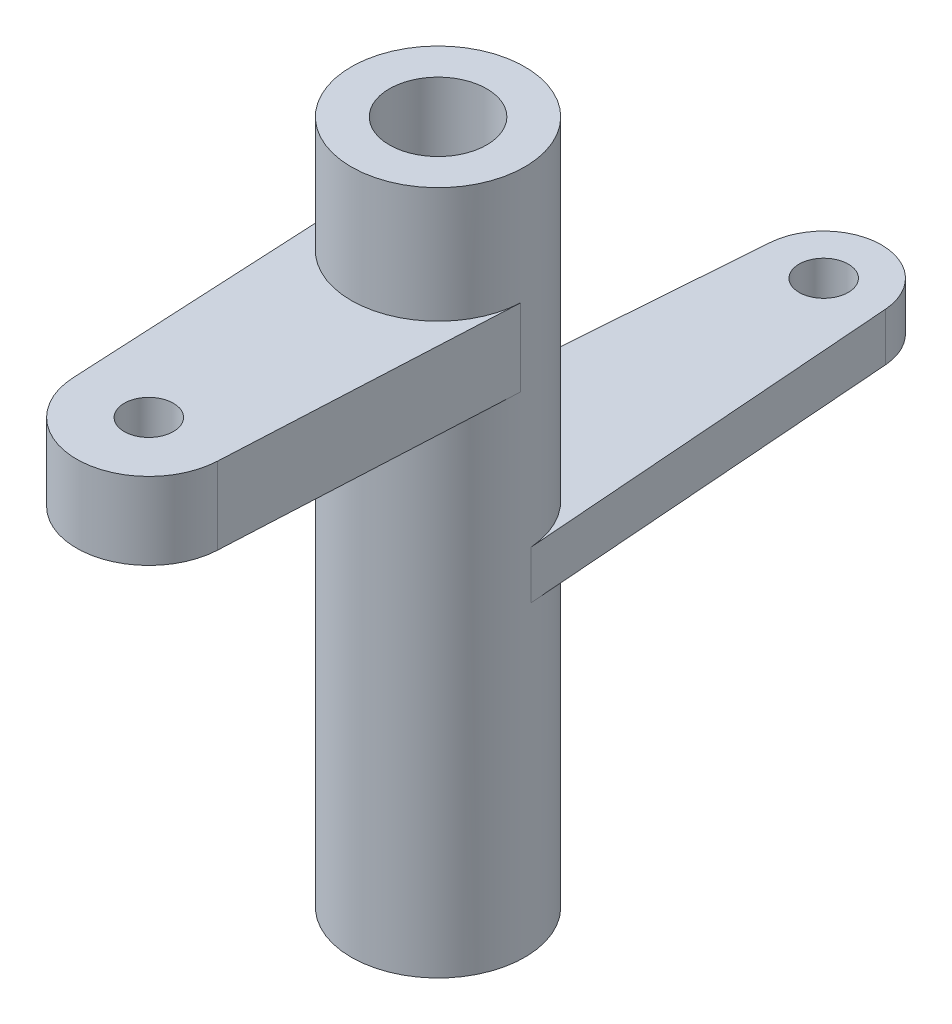
ISO-10303-21;
HEADER;
FILE_DESCRIPTION(('STEP AP214'),'2;1');
FILE_NAME('part.step','',(''),(''),'','','');
FILE_SCHEMA(('AUTOMOTIVE_DESIGN { 1 0 10303 214 1 1 1 1 }'));
ENDSEC;
DATA;
#1=APPLICATION_CONTEXT('core data for automotive mechanical design processes');
#2=APPLICATION_PROTOCOL_DEFINITION('international standard','automotive_design',2000,#1);
#3=PRODUCT_CONTEXT('',#1,'mechanical');
#4=PRODUCT('Part','Part','',(#3));
#5=PRODUCT_RELATED_PRODUCT_CATEGORY('part','',(#4));
#6=PRODUCT_DEFINITION_FORMATION('','',#4);
#7=PRODUCT_DEFINITION_CONTEXT('part definition',#1,'design');
#8=PRODUCT_DEFINITION('design','',#6,#7);
#9=PRODUCT_DEFINITION_SHAPE('','',#8);
#10=(LENGTH_UNIT() NAMED_UNIT(*) SI_UNIT(.MILLI.,.METRE.));
#11=(NAMED_UNIT(*) PLANE_ANGLE_UNIT() SI_UNIT($,.RADIAN.));
#12=(NAMED_UNIT(*) SI_UNIT($,.STERADIAN.) SOLID_ANGLE_UNIT());
#13=UNCERTAINTY_MEASURE_WITH_UNIT(LENGTH_MEASURE(1.E-05),#10,'distance_accuracy_value','');
#14=(GEOMETRIC_REPRESENTATION_CONTEXT(3) GLOBAL_UNCERTAINTY_ASSIGNED_CONTEXT((#13)) GLOBAL_UNIT_ASSIGNED_CONTEXT((#10,
#11,#12)) REPRESENTATION_CONTEXT('',''));
#15=CARTESIAN_POINT('',(0.,0.,0.));
#16=DIRECTION('',(0.,0.,1.));
#17=DIRECTION('',(1.,0.,0.));
#18=AXIS2_PLACEMENT_3D('',#15,#16,#17);
#19=CARTESIAN_POINT('',(0.,71.,0.));
#20=DIRECTION('',(0.,1.,0.));
#21=DIRECTION('',(0.,0.,1.));
#22=AXIS2_PLACEMENT_3D('',#19,#20,#21);
#23=PLANE('',#22);
#24=CARTESIAN_POINT('',(0.,71.,0.));
#25=DIRECTION('',(0.,1.,0.));
#26=DIRECTION('',(0.,0.,1.));
#27=AXIS2_PLACEMENT_3D('',#24,#25,#26);
#28=CIRCLE('',#27,9.);
#29=CARTESIAN_POINT('',(0.,71.,9.));
#30=VERTEX_POINT('',#29);
#31=EDGE_CURVE('E11',#30,#30,#28,.T.);
#32=ORIENTED_EDGE('',*,*,#31,.T.);
#33=EDGE_LOOP('',(#32));
#34=FACE_BOUND('',#33,.T.);
#35=CARTESIAN_POINT('',(0.,71.,0.));
#36=DIRECTION('',(0.,1.,0.));
#37=DIRECTION('',(0.,0.,1.));
#38=AXIS2_PLACEMENT_3D('',#35,#36,#37);
#39=CIRCLE('',#38,5.05);
#40=CARTESIAN_POINT('',(0.,71.,5.05));
#41=VERTEX_POINT('',#40);
#42=EDGE_CURVE('E191',#41,#41,#39,.T.);
#43=ORIENTED_EDGE('',*,*,#42,.F.);
#44=EDGE_LOOP('',(#43));
#45=FACE_BOUND('',#44,.T.);
#46=ADVANCED_FACE('F41',(#34,#45),#23,.T.);
#47=CARTESIAN_POINT('',(0.,0.,0.));
#48=DIRECTION('',(0.,1.,0.));
#49=DIRECTION('',(0.,0.,1.));
#50=AXIS2_PLACEMENT_3D('',#47,#48,#49);
#51=PLANE('',#50);
#52=CARTESIAN_POINT('',(0.,0.,0.));
#53=DIRECTION('',(0.,1.,0.));
#54=DIRECTION('',(0.,0.,1.));
#55=AXIS2_PLACEMENT_3D('',#52,#53,#54);
#56=CIRCLE('',#55,9.);
#57=CARTESIAN_POINT('',(0.,0.,9.));
#58=VERTEX_POINT('',#57);
#59=EDGE_CURVE('E45',#58,#58,#56,.T.);
#60=ORIENTED_EDGE('',*,*,#59,.F.);
#61=EDGE_LOOP('',(#60));
#62=FACE_BOUND('',#61,.T.);
#63=CARTESIAN_POINT('',(0.,0.,0.));
#64=DIRECTION('',(0.,1.,0.));
#65=DIRECTION('',(0.,0.,1.));
#66=AXIS2_PLACEMENT_3D('',#63,#64,#65);
#67=CIRCLE('',#66,5.05);
#68=CARTESIAN_POINT('',(0.,0.,5.05));
#69=VERTEX_POINT('',#68);
#70=EDGE_CURVE('E190',#69,#69,#67,.T.);
#71=ORIENTED_EDGE('',*,*,#70,.T.);
#72=EDGE_LOOP('',(#71));
#73=FACE_BOUND('',#72,.T.);
#74=ADVANCED_FACE('F200',(#62,#73),#51,.F.);
#75=CARTESIAN_POINT('',(0.,71.,0.));
#76=DIRECTION('',(0.,-1.,0.));
#77=DIRECTION('',(0.,0.,-1.));
#78=AXIS2_PLACEMENT_3D('',#75,#76,#77);
#79=CYLINDRICAL_SURFACE('',#78,9.);
#80=DIRECTION('',(0.,-1.,0.));
#81=VECTOR('',#80,1.);
#82=CARTESIAN_POINT('',(-8.98874295994718,59.,0.450000000000001));
#83=LINE('',#82,#81);
#84=CARTESIAN_POINT('',(-8.98874295994718,59.,0.450000000000001));
#85=VERTEX_POINT('',#84);
#86=CARTESIAN_POINT('',(-8.98874295994718,51.,0.450000000000001));
#87=VERTEX_POINT('',#86);
#88=EDGE_CURVE('E62',#85,#87,#83,.T.);
#89=ORIENTED_EDGE('',*,*,#88,.F.);
#90=CARTESIAN_POINT('',(0.,59.,0.));
#91=DIRECTION('',(0.,1.,0.));
#92=DIRECTION('',(0.,0.,1.));
#93=AXIS2_PLACEMENT_3D('',#90,#91,#92);
#94=CIRCLE('',#93,9.);
#95=CARTESIAN_POINT('',(8.98874295994718,59.,0.45));
#96=VERTEX_POINT('',#95);
#97=EDGE_CURVE('E57',#85,#96,#94,.T.);
#98=ORIENTED_EDGE('',*,*,#97,.T.);
#99=DIRECTION('',(0.,-1.,0.));
#100=VECTOR('',#99,1.);
#101=CARTESIAN_POINT('',(8.98874295994718,59.,0.449999999999999));
#102=LINE('',#101,#100);
#103=CARTESIAN_POINT('',(8.98874295994718,51.,0.449999999999999));
#104=VERTEX_POINT('',#103);
#105=EDGE_CURVE('E112',#96,#104,#102,.T.);
#106=ORIENTED_EDGE('',*,*,#105,.T.);
#107=CARTESIAN_POINT('',(0.,51.,0.));
#108=DIRECTION('',(0.,1.,0.));
#109=DIRECTION('',(0.,0.,1.));
#110=AXIS2_PLACEMENT_3D('',#107,#108,#109);
#111=CIRCLE('',#110,9.);
#112=EDGE_CURVE('E237',#87,#104,#111,.T.);
#113=ORIENTED_EDGE('',*,*,#112,.F.);
#114=EDGE_LOOP('',(#89,#98,#106,#113));
#115=FACE_BOUND('',#114,.T.);
#116=DIRECTION('',(0.,-1.,0.));
#117=VECTOR('',#116,1.);
#118=CARTESIAN_POINT('',(8.97465180383061,36.5,-0.675));
#119=LINE('',#118,#117);
#120=CARTESIAN_POINT('',(8.97465180383061,36.5,-0.675));
#121=VERTEX_POINT('',#120);
#122=CARTESIAN_POINT('',(8.97465180383061,31.5,-0.675));
#123=VERTEX_POINT('',#122);
#124=EDGE_CURVE('E179',#121,#123,#119,.T.);
#125=ORIENTED_EDGE('',*,*,#124,.F.);
#126=CARTESIAN_POINT('',(0.,36.5,0.));
#127=DIRECTION('',(0.,1.,0.));
#128=DIRECTION('',(0.,0.,1.));
#129=AXIS2_PLACEMENT_3D('',#126,#127,#128);
#130=CIRCLE('',#129,9.);
#131=CARTESIAN_POINT('',(-8.97465180383061,36.5,-0.675));
#132=VERTEX_POINT('',#131);
#133=EDGE_CURVE('E151',#121,#132,#130,.T.);
#134=ORIENTED_EDGE('',*,*,#133,.T.);
#135=DIRECTION('',(0.,-1.,0.));
#136=VECTOR('',#135,1.);
#137=CARTESIAN_POINT('',(-8.97465180383061,36.5,-0.675));
#138=LINE('',#137,#136);
#139=CARTESIAN_POINT('',(-8.97465180383061,31.5,-0.675));
#140=VERTEX_POINT('',#139);
#141=EDGE_CURVE('E183',#132,#140,#138,.T.);
#142=ORIENTED_EDGE('',*,*,#141,.T.);
#143=CARTESIAN_POINT('',(0.,31.5,0.));
#144=DIRECTION('',(0.,1.,0.));
#145=DIRECTION('',(0.,0.,1.));
#146=AXIS2_PLACEMENT_3D('',#143,#144,#145);
#147=CIRCLE('',#146,9.);
#148=EDGE_CURVE('E166',#123,#140,#147,.T.);
#149=ORIENTED_EDGE('',*,*,#148,.F.);
#150=EDGE_LOOP('',(#125,#134,#142,#149));
#151=FACE_BOUND('',#150,.T.);
#152=ORIENTED_EDGE('',*,*,#31,.F.);
#153=EDGE_LOOP('',(#152));
#154=FACE_BOUND('',#153,.T.);
#155=ORIENTED_EDGE('',*,*,#59,.T.);
#156=EDGE_LOOP('',(#155));
#157=FACE_BOUND('',#156,.T.);
#158=ADVANCED_FACE('F43',(#115,#151,#154,#157),#79,.T.);
#159=CARTESIAN_POINT('',(0.,71.,0.));
#160=DIRECTION('',(0.,-1.,0.));
#161=DIRECTION('',(0.,0.,-1.));
#162=AXIS2_PLACEMENT_3D('',#159,#160,#161);
#163=CYLINDRICAL_SURFACE('',#162,5.05);
#164=ORIENTED_EDGE('',*,*,#42,.T.);
#165=EDGE_LOOP('',(#164));
#166=FACE_BOUND('',#165,.T.);
#167=ORIENTED_EDGE('',*,*,#70,.F.);
#168=EDGE_LOOP('',(#167));
#169=FACE_BOUND('',#168,.T.);
#170=ADVANCED_FACE('F202',(#166,#169),#163,.F.);
#171=CARTESIAN_POINT('',(0.,36.5,-40.));
#172=DIRECTION('',(0.,-1.,0.));
#173=DIRECTION('',(0.,0.,-1.));
#174=AXIS2_PLACEMENT_3D('',#171,#172,#173);
#175=CYLINDRICAL_SURFACE('',#174,6.);
#176=CARTESIAN_POINT('',(0.,31.5,-40.));
#177=DIRECTION('',(0.,1.,0.));
#178=DIRECTION('',(0.,0.,1.));
#179=AXIS2_PLACEMENT_3D('',#176,#177,#178);
#180=CIRCLE('',#179,6.);
#181=CARTESIAN_POINT('',(5.98310120255374,31.5,-40.45));
#182=VERTEX_POINT('',#181);
#183=CARTESIAN_POINT('',(-5.98310120255374,31.5,-40.45));
#184=VERTEX_POINT('',#183);
#185=EDGE_CURVE('E131',#182,#184,#180,.T.);
#186=ORIENTED_EDGE('',*,*,#185,.T.);
#187=DIRECTION('',(0.,-1.,0.));
#188=VECTOR('',#187,1.);
#189=CARTESIAN_POINT('',(-5.98310120255374,36.5,-40.45));
#190=LINE('',#189,#188);
#191=CARTESIAN_POINT('',(-5.98310120255374,36.5,-40.45));
#192=VERTEX_POINT('',#191);
#193=EDGE_CURVE('E186',#192,#184,#190,.T.);
#194=ORIENTED_EDGE('',*,*,#193,.F.);
#195=CARTESIAN_POINT('',(0.,36.5,-40.));
#196=DIRECTION('',(0.,1.,0.));
#197=DIRECTION('',(0.,0.,1.));
#198=AXIS2_PLACEMENT_3D('',#195,#196,#197);
#199=CIRCLE('',#198,6.);
#200=CARTESIAN_POINT('',(5.98310120255374,36.5,-40.45));
#201=VERTEX_POINT('',#200);
#202=EDGE_CURVE('E142',#201,#192,#199,.T.);
#203=ORIENTED_EDGE('',*,*,#202,.F.);
#204=DIRECTION('',(0.,-1.,0.));
#205=VECTOR('',#204,1.);
#206=CARTESIAN_POINT('',(5.98310120255374,36.5,-40.45));
#207=LINE('',#206,#205);
#208=EDGE_CURVE('E161',#201,#182,#207,.T.);
#209=ORIENTED_EDGE('',*,*,#208,.T.);
#210=EDGE_LOOP('',(#186,#194,#203,#209));
#211=FACE_BOUND('',#210,.T.);
#212=ADVANCED_FACE('F204',(#211),#175,.T.);
#213=CARTESIAN_POINT('',(-8.97465180383061,36.5,-0.675));
#214=DIRECTION('',(0.997183533758957,0.,0.075));
#215=DIRECTION('',(0.075,0.,-0.997183533758957));
#216=AXIS2_PLACEMENT_3D('',#213,#214,#215);
#217=PLANE('',#216);
#218=DIRECTION('',(-0.075,0.,0.997183533758957));
#219=VECTOR('',#218,1.);
#220=CARTESIAN_POINT('',(-8.97465180383061,31.5,-0.675));
#221=LINE('',#220,#219);
#222=EDGE_CURVE('E136',#184,#140,#221,.T.);
#223=ORIENTED_EDGE('',*,*,#222,.T.);
#224=ORIENTED_EDGE('',*,*,#141,.F.);
#225=DIRECTION('',(-0.075,0.,0.997183533758957));
#226=VECTOR('',#225,1.);
#227=CARTESIAN_POINT('',(-8.97465180383061,36.5,-0.675));
#228=LINE('',#227,#226);
#229=EDGE_CURVE('E146',#192,#132,#228,.T.);
#230=ORIENTED_EDGE('',*,*,#229,.F.);
#231=ORIENTED_EDGE('',*,*,#193,.T.);
#232=EDGE_LOOP('',(#223,#224,#230,#231));
#233=FACE_BOUND('',#232,.T.);
#234=ADVANCED_FACE('F211',(#233),#217,.F.);
#235=CARTESIAN_POINT('',(8.97465180383061,36.5,-0.675));
#236=DIRECTION('',(0.997183533758957,0.,-0.075));
#237=DIRECTION('',(-0.075,0.,-0.997183533758957));
#238=AXIS2_PLACEMENT_3D('',#235,#236,#237);
#239=PLANE('',#238);
#240=DIRECTION('',(0.075,0.,0.997183533758957));
#241=VECTOR('',#240,1.);
#242=CARTESIAN_POINT('',(8.97465180383061,31.5,-0.675));
#243=LINE('',#242,#241);
#244=EDGE_CURVE('E170',#182,#123,#243,.T.);
#245=ORIENTED_EDGE('',*,*,#244,.F.);
#246=ORIENTED_EDGE('',*,*,#208,.F.);
#247=DIRECTION('',(0.075,0.,0.997183533758957));
#248=VECTOR('',#247,1.);
#249=CARTESIAN_POINT('',(8.97465180383061,36.5,-0.675));
#250=LINE('',#249,#248);
#251=EDGE_CURVE('E154',#201,#121,#250,.T.);
#252=ORIENTED_EDGE('',*,*,#251,.T.);
#253=ORIENTED_EDGE('',*,*,#124,.T.);
#254=EDGE_LOOP('',(#245,#246,#252,#253));
#255=FACE_BOUND('',#254,.T.);
#256=ADVANCED_FACE('F292',(#255),#239,.T.);
#257=CARTESIAN_POINT('',(0.,36.5,-40.));
#258=DIRECTION('',(0.,-1.,0.));
#259=DIRECTION('',(0.,0.,-1.));
#260=AXIS2_PLACEMENT_3D('',#257,#258,#259);
#261=CYLINDRICAL_SURFACE('',#260,2.55);
#262=CARTESIAN_POINT('',(0.,36.5,-40.));
#263=DIRECTION('',(0.,1.,0.));
#264=DIRECTION('',(0.,0.,1.));
#265=AXIS2_PLACEMENT_3D('',#262,#263,#264);
#266=CIRCLE('',#265,2.55);
#267=CARTESIAN_POINT('',(0.,36.5,-37.45));
#268=VERTEX_POINT('',#267);
#269=EDGE_CURVE('E158',#268,#268,#266,.T.);
#270=ORIENTED_EDGE('',*,*,#269,.T.);
#271=EDGE_LOOP('',(#270));
#272=FACE_BOUND('',#271,.T.);
#273=CARTESIAN_POINT('',(0.,31.5,-40.));
#274=DIRECTION('',(0.,1.,0.));
#275=DIRECTION('',(0.,0.,1.));
#276=AXIS2_PLACEMENT_3D('',#273,#274,#275);
#277=CIRCLE('',#276,2.55);
#278=CARTESIAN_POINT('',(0.,31.5,-37.45));
#279=VERTEX_POINT('',#278);
#280=EDGE_CURVE('E147',#279,#279,#277,.T.);
#281=ORIENTED_EDGE('',*,*,#280,.F.);
#282=EDGE_LOOP('',(#281));
#283=FACE_BOUND('',#282,.T.);
#284=ADVANCED_FACE('F285',(#272,#283),#261,.F.);
#285=CARTESIAN_POINT('',(0.,36.5,0.));
#286=DIRECTION('',(0.,1.,0.));
#287=DIRECTION('',(0.,0.,1.));
#288=AXIS2_PLACEMENT_3D('',#285,#286,#287);
#289=PLANE('',#288);
#290=ORIENTED_EDGE('',*,*,#202,.T.);
#291=ORIENTED_EDGE('',*,*,#229,.T.);
#292=ORIENTED_EDGE('',*,*,#133,.F.);
#293=ORIENTED_EDGE('',*,*,#251,.F.);
#294=EDGE_LOOP('',(#290,#291,#292,#293));
#295=FACE_BOUND('',#294,.T.);
#296=ORIENTED_EDGE('',*,*,#269,.F.);
#297=EDGE_LOOP('',(#296));
#298=FACE_BOUND('',#297,.T.);
#299=ADVANCED_FACE('F282',(#295,#298),#289,.T.);
#300=CARTESIAN_POINT('',(0.,31.5,0.));
#301=DIRECTION('',(0.,1.,0.));
#302=DIRECTION('',(0.,0.,1.));
#303=AXIS2_PLACEMENT_3D('',#300,#301,#302);
#304=PLANE('',#303);
#305=ORIENTED_EDGE('',*,*,#185,.F.);
#306=ORIENTED_EDGE('',*,*,#244,.T.);
#307=ORIENTED_EDGE('',*,*,#148,.T.);
#308=ORIENTED_EDGE('',*,*,#222,.F.);
#309=EDGE_LOOP('',(#305,#306,#307,#308));
#310=FACE_BOUND('',#309,.T.);
#311=ORIENTED_EDGE('',*,*,#280,.T.);
#312=EDGE_LOOP('',(#311));
#313=FACE_BOUND('',#312,.T.);
#314=ADVANCED_FACE('F281',(#310,#313),#304,.F.);
#315=CARTESIAN_POINT('',(0.,59.,30.));
#316=DIRECTION('',(0.,-1.,0.));
#317=DIRECTION('',(0.,0.,-1.));
#318=AXIS2_PLACEMENT_3D('',#315,#316,#317);
#319=CYLINDRICAL_SURFACE('',#318,7.5);
#320=CARTESIAN_POINT('',(0.,51.,30.));
#321=DIRECTION('',(0.,1.,0.));
#322=DIRECTION('',(0.,0.,1.));
#323=AXIS2_PLACEMENT_3D('',#320,#321,#322);
#324=CIRCLE('',#323,7.5);
#325=CARTESIAN_POINT('',(-7.49061913328931,51.,30.375));
#326=VERTEX_POINT('',#325);
#327=CARTESIAN_POINT('',(7.49061913328932,51.,30.375));
#328=VERTEX_POINT('',#327);
#329=EDGE_CURVE('E129',#326,#328,#324,.T.);
#330=ORIENTED_EDGE('',*,*,#329,.T.);
#331=DIRECTION('',(0.,-1.,0.));
#332=VECTOR('',#331,1.);
#333=CARTESIAN_POINT('',(7.49061913328932,59.,30.375));
#334=LINE('',#333,#332);
#335=CARTESIAN_POINT('',(7.49061913328932,59.,30.375));
#336=VERTEX_POINT('',#335);
#337=EDGE_CURVE('E110',#336,#328,#334,.T.);
#338=ORIENTED_EDGE('',*,*,#337,.F.);
#339=CARTESIAN_POINT('',(0.,59.,30.));
#340=DIRECTION('',(0.,1.,0.));
#341=DIRECTION('',(0.,0.,1.));
#342=AXIS2_PLACEMENT_3D('',#339,#340,#341);
#343=CIRCLE('',#342,7.5);
#344=CARTESIAN_POINT('',(-7.49061913328931,59.,30.375));
#345=VERTEX_POINT('',#344);
#346=EDGE_CURVE('E115',#345,#336,#343,.T.);
#347=ORIENTED_EDGE('',*,*,#346,.F.);
#348=DIRECTION('',(0.,-1.,0.));
#349=VECTOR('',#348,1.);
#350=CARTESIAN_POINT('',(-7.49061913328931,59.,30.375));
#351=LINE('',#350,#349);
#352=EDGE_CURVE('E241',#345,#326,#351,.T.);
#353=ORIENTED_EDGE('',*,*,#352,.T.);
#354=EDGE_LOOP('',(#330,#338,#347,#353));
#355=FACE_BOUND('',#354,.T.);
#356=ADVANCED_FACE('F127',(#355),#319,.T.);
#357=CARTESIAN_POINT('',(8.98874295994718,59.,0.45));
#358=DIRECTION('',(-0.998749217771909,0.,-0.0499999999999999));
#359=DIRECTION('',(-0.0499999999999999,0.,0.998749217771909));
#360=AXIS2_PLACEMENT_3D('',#357,#358,#359);
#361=PLANE('',#360);
#362=DIRECTION('',(0.0499999999999999,0.,-0.998749217771909));
#363=VECTOR('',#362,1.);
#364=CARTESIAN_POINT('',(8.98874295994718,51.,0.45));
#365=LINE('',#364,#363);
#366=EDGE_CURVE('E250',#328,#104,#365,.T.);
#367=ORIENTED_EDGE('',*,*,#366,.T.);
#368=ORIENTED_EDGE('',*,*,#105,.F.);
#369=DIRECTION('',(0.0499999999999999,0.,-0.998749217771909));
#370=VECTOR('',#369,1.);
#371=CARTESIAN_POINT('',(8.98874295994718,59.,0.45));
#372=LINE('',#371,#370);
#373=EDGE_CURVE('E105',#336,#96,#372,.T.);
#374=ORIENTED_EDGE('',*,*,#373,.F.);
#375=ORIENTED_EDGE('',*,*,#337,.T.);
#376=EDGE_LOOP('',(#367,#368,#374,#375));
#377=FACE_BOUND('',#376,.T.);
#378=ADVANCED_FACE('F108',(#377),#361,.F.);
#379=CARTESIAN_POINT('',(-8.98874295994718,59.,0.450000000000001));
#380=DIRECTION('',(-0.998749217771909,0.,0.0500000000000001));
#381=DIRECTION('',(0.0500000000000001,0.,0.998749217771909));
#382=AXIS2_PLACEMENT_3D('',#379,#380,#381);
#383=PLANE('',#382);
#384=DIRECTION('',(-0.0500000000000001,0.,-0.998749217771909));
#385=VECTOR('',#384,1.);
#386=CARTESIAN_POINT('',(-8.98874295994718,51.,0.450000000000001));
#387=LINE('',#386,#385);
#388=EDGE_CURVE('E232',#326,#87,#387,.T.);
#389=ORIENTED_EDGE('',*,*,#388,.F.);
#390=ORIENTED_EDGE('',*,*,#352,.F.);
#391=DIRECTION('',(-0.0500000000000001,0.,-0.998749217771909));
#392=VECTOR('',#391,1.);
#393=CARTESIAN_POINT('',(-8.98874295994718,59.,0.450000000000001));
#394=LINE('',#393,#392);
#395=EDGE_CURVE('E122',#345,#85,#394,.T.);
#396=ORIENTED_EDGE('',*,*,#395,.T.);
#397=ORIENTED_EDGE('',*,*,#88,.T.);
#398=EDGE_LOOP('',(#389,#390,#396,#397));
#399=FACE_BOUND('',#398,.T.);
#400=ADVANCED_FACE('F246',(#399),#383,.T.);
#401=CARTESIAN_POINT('',(0.,59.,30.));
#402=DIRECTION('',(0.,-1.,0.));
#403=DIRECTION('',(0.,0.,-1.));
#404=AXIS2_PLACEMENT_3D('',#401,#402,#403);
#405=CYLINDRICAL_SURFACE('',#404,2.55);
#406=CARTESIAN_POINT('',(0.,59.,30.));
#407=DIRECTION('',(0.,1.,0.));
#408=DIRECTION('',(0.,0.,1.));
#409=AXIS2_PLACEMENT_3D('',#406,#407,#408);
#410=CIRCLE('',#409,2.55);
#411=CARTESIAN_POINT('',(0.,59.,32.55));
#412=VERTEX_POINT('',#411);
#413=EDGE_CURVE('E243',#412,#412,#410,.T.);
#414=ORIENTED_EDGE('',*,*,#413,.T.);
#415=EDGE_LOOP('',(#414));
#416=FACE_BOUND('',#415,.T.);
#417=CARTESIAN_POINT('',(0.,51.,30.));
#418=DIRECTION('',(0.,1.,0.));
#419=DIRECTION('',(0.,0.,1.));
#420=AXIS2_PLACEMENT_3D('',#417,#418,#419);
#421=CIRCLE('',#420,2.55);
#422=CARTESIAN_POINT('',(0.,51.,32.55));
#423=VERTEX_POINT('',#422);
#424=EDGE_CURVE('E125',#423,#423,#421,.T.);
#425=ORIENTED_EDGE('',*,*,#424,.F.);
#426=EDGE_LOOP('',(#425));
#427=FACE_BOUND('',#426,.T.);
#428=ADVANCED_FACE('F264',(#416,#427),#405,.F.);
#429=CARTESIAN_POINT('',(0.,59.,0.));
#430=DIRECTION('',(0.,1.,0.));
#431=DIRECTION('',(0.,0.,1.));
#432=AXIS2_PLACEMENT_3D('',#429,#430,#431);
#433=PLANE('',#432);
#434=ORIENTED_EDGE('',*,*,#346,.T.);
#435=ORIENTED_EDGE('',*,*,#373,.T.);
#436=ORIENTED_EDGE('',*,*,#97,.F.);
#437=ORIENTED_EDGE('',*,*,#395,.F.);
#438=EDGE_LOOP('',(#434,#435,#436,#437));
#439=FACE_BOUND('',#438,.T.);
#440=ORIENTED_EDGE('',*,*,#413,.F.);
#441=EDGE_LOOP('',(#440));
#442=FACE_BOUND('',#441,.T.);
#443=ADVANCED_FACE('F119',(#439,#442),#433,.T.);
#444=CARTESIAN_POINT('',(0.,51.,0.));
#445=DIRECTION('',(0.,1.,0.));
#446=DIRECTION('',(0.,0.,1.));
#447=AXIS2_PLACEMENT_3D('',#444,#445,#446);
#448=PLANE('',#447);
#449=ORIENTED_EDGE('',*,*,#329,.F.);
#450=ORIENTED_EDGE('',*,*,#388,.T.);
#451=ORIENTED_EDGE('',*,*,#112,.T.);
#452=ORIENTED_EDGE('',*,*,#366,.F.);
#453=EDGE_LOOP('',(#449,#450,#451,#452));
#454=FACE_BOUND('',#453,.T.);
#455=ORIENTED_EDGE('',*,*,#424,.T.);
#456=EDGE_LOOP('',(#455));
#457=FACE_BOUND('',#456,.T.);
#458=ADVANCED_FACE('F249',(#454,#457),#448,.F.);
#459=CLOSED_SHELL('',(#46,#74,#158,#170,#212,#234,#256,#284,#299,#314,#356,#378,#400,#428,#443,#458));
#460=MANIFOLD_SOLID_BREP('B2',#459);
#461=ADVANCED_BREP_SHAPE_REPRESENTATION('',(#18,#460),#14);
#462=SHAPE_DEFINITION_REPRESENTATION(#9,#461);
ENDSEC;
END-ISO-10303-21;
